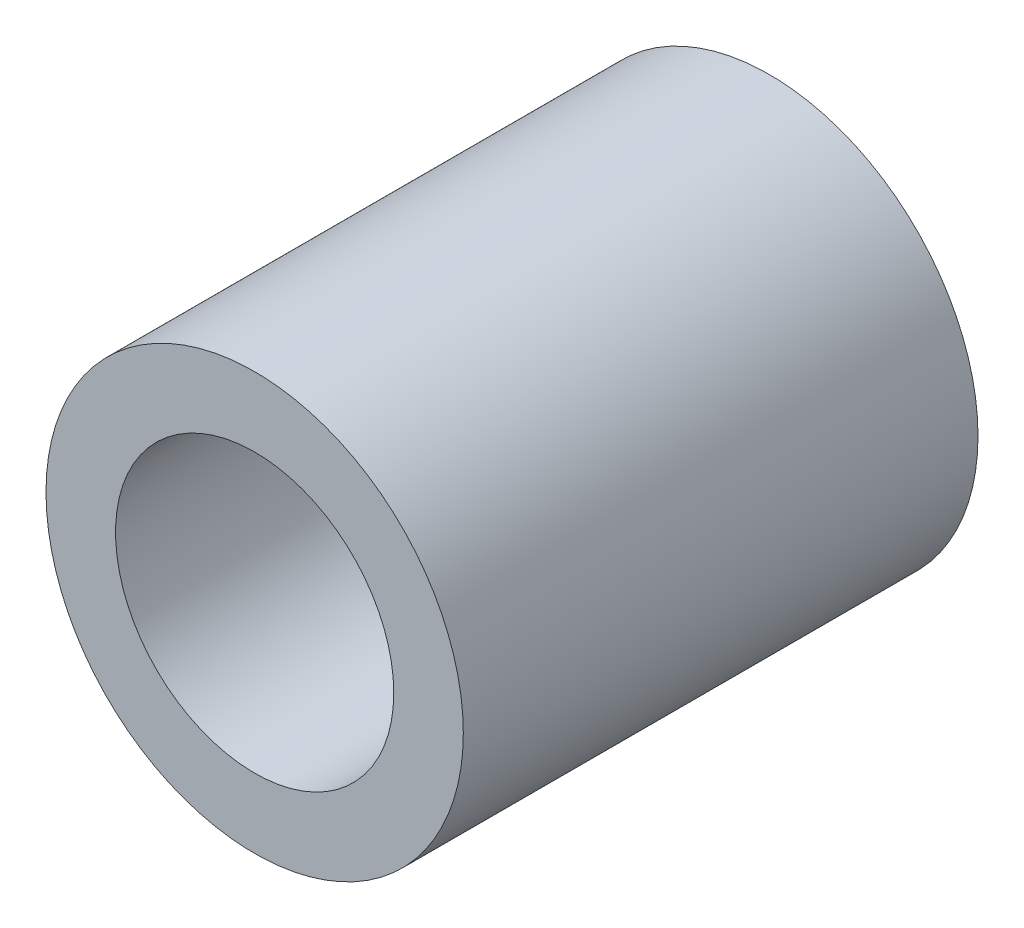
ISO-10303-21;
HEADER;
FILE_DESCRIPTION(('STEP AP214'),'2;1');
FILE_NAME('part.step','',(''),(''),'','','');
FILE_SCHEMA(('AUTOMOTIVE_DESIGN { 1 0 10303 214 1 1 1 1 }'));
ENDSEC;
DATA;
#1=APPLICATION_CONTEXT('core data for automotive mechanical design processes');
#2=APPLICATION_PROTOCOL_DEFINITION('international standard','automotive_design',2000,#1);
#3=PRODUCT_CONTEXT('',#1,'mechanical');
#4=PRODUCT('Part','Part','',(#3));
#5=PRODUCT_RELATED_PRODUCT_CATEGORY('part','',(#4));
#6=PRODUCT_DEFINITION_FORMATION('','',#4);
#7=PRODUCT_DEFINITION_CONTEXT('part definition',#1,'design');
#8=PRODUCT_DEFINITION('design','',#6,#7);
#9=PRODUCT_DEFINITION_SHAPE('','',#8);
#10=(LENGTH_UNIT() NAMED_UNIT(*) SI_UNIT(.MILLI.,.METRE.));
#11=(NAMED_UNIT(*) PLANE_ANGLE_UNIT() SI_UNIT($,.RADIAN.));
#12=(NAMED_UNIT(*) SI_UNIT($,.STERADIAN.) SOLID_ANGLE_UNIT());
#13=UNCERTAINTY_MEASURE_WITH_UNIT(LENGTH_MEASURE(1.E-05),#10,'distance_accuracy_value','');
#14=(GEOMETRIC_REPRESENTATION_CONTEXT(3) GLOBAL_UNCERTAINTY_ASSIGNED_CONTEXT((#13)) GLOBAL_UNIT_ASSIGNED_CONTEXT((#10,
#11,#12)) REPRESENTATION_CONTEXT('',''));
#15=CARTESIAN_POINT('',(0.,0.,0.));
#16=DIRECTION('',(0.,0.,1.));
#17=DIRECTION('',(1.,0.,0.));
#18=AXIS2_PLACEMENT_3D('',#15,#16,#17);
#19=CARTESIAN_POINT('',(0.,0.,5.87375));
#20=DIRECTION('',(0.,0.,1.));
#21=DIRECTION('',(1.,0.,0.));
#22=AXIS2_PLACEMENT_3D('',#19,#20,#21);
#23=PLANE('',#22);
#24=CARTESIAN_POINT('',(0.,0.,5.87375));
#25=DIRECTION('',(0.,0.,1.));
#26=DIRECTION('',(1.,0.,0.));
#27=AXIS2_PLACEMENT_3D('',#24,#25,#26);
#28=CIRCLE('',#27,2.38125);
#29=CARTESIAN_POINT('',(2.38125,0.,5.87375));
#30=VERTEX_POINT('',#29);
#31=EDGE_CURVE('E10',#30,#30,#28,.T.);
#32=ORIENTED_EDGE('',*,*,#31,.T.);
#33=EDGE_LOOP('',(#32));
#34=FACE_BOUND('',#33,.T.);
#35=CARTESIAN_POINT('',(0.,0.,5.87375));
#36=DIRECTION('',(0.,0.,1.));
#37=DIRECTION('',(1.,0.,0.));
#38=AXIS2_PLACEMENT_3D('',#35,#36,#37);
#39=CIRCLE('',#38,1.5875);
#40=CARTESIAN_POINT('',(1.5875,0.,5.87375));
#41=VERTEX_POINT('',#40);
#42=EDGE_CURVE('E56',#41,#41,#39,.T.);
#43=ORIENTED_EDGE('',*,*,#42,.F.);
#44=EDGE_LOOP('',(#43));
#45=FACE_BOUND('',#44,.T.);
#46=ADVANCED_FACE('F43',(#34,#45),#23,.T.);
#47=CARTESIAN_POINT('',(0.,0.,0.));
#48=DIRECTION('',(0.,0.,1.));
#49=DIRECTION('',(1.,0.,0.));
#50=AXIS2_PLACEMENT_3D('',#47,#48,#49);
#51=PLANE('',#50);
#52=CARTESIAN_POINT('',(0.,0.,0.));
#53=DIRECTION('',(0.,0.,1.));
#54=DIRECTION('',(1.,0.,0.));
#55=AXIS2_PLACEMENT_3D('',#52,#53,#54);
#56=CIRCLE('',#55,2.38125);
#57=CARTESIAN_POINT('',(2.38125,0.,0.));
#58=VERTEX_POINT('',#57);
#59=EDGE_CURVE('E47',#58,#58,#56,.T.);
#60=ORIENTED_EDGE('',*,*,#59,.F.);
#61=EDGE_LOOP('',(#60));
#62=FACE_BOUND('',#61,.T.);
#63=CARTESIAN_POINT('',(0.,0.,0.));
#64=DIRECTION('',(0.,0.,1.));
#65=DIRECTION('',(1.,0.,0.));
#66=AXIS2_PLACEMENT_3D('',#63,#64,#65);
#67=CIRCLE('',#66,1.5875);
#68=CARTESIAN_POINT('',(1.5875,0.,0.));
#69=VERTEX_POINT('',#68);
#70=EDGE_CURVE('E58',#69,#69,#67,.T.);
#71=ORIENTED_EDGE('',*,*,#70,.T.);
#72=EDGE_LOOP('',(#71));
#73=FACE_BOUND('',#72,.T.);
#74=ADVANCED_FACE('F70',(#62,#73),#51,.F.);
#75=CARTESIAN_POINT('',(0.,0.,5.87375));
#76=DIRECTION('',(0.,0.,-1.));
#77=DIRECTION('',(-1.,0.,0.));
#78=AXIS2_PLACEMENT_3D('',#75,#76,#77);
#79=CYLINDRICAL_SURFACE('',#78,2.38125);
#80=ORIENTED_EDGE('',*,*,#31,.F.);
#81=EDGE_LOOP('',(#80));
#82=FACE_BOUND('',#81,.T.);
#83=ORIENTED_EDGE('',*,*,#59,.T.);
#84=EDGE_LOOP('',(#83));
#85=FACE_BOUND('',#84,.T.);
#86=ADVANCED_FACE('F45',(#82,#85),#79,.T.);
#87=CARTESIAN_POINT('',(0.,0.,5.87375));
#88=DIRECTION('',(0.,0.,-1.));
#89=DIRECTION('',(-1.,0.,0.));
#90=AXIS2_PLACEMENT_3D('',#87,#88,#89);
#91=CYLINDRICAL_SURFACE('',#90,1.5875);
#92=ORIENTED_EDGE('',*,*,#42,.T.);
#93=EDGE_LOOP('',(#92));
#94=FACE_BOUND('',#93,.T.);
#95=ORIENTED_EDGE('',*,*,#70,.F.);
#96=EDGE_LOOP('',(#95));
#97=FACE_BOUND('',#96,.T.);
#98=ADVANCED_FACE('F66',(#94,#97),#91,.F.);
#99=CLOSED_SHELL('',(#46,#74,#86,#98));
#100=MANIFOLD_SOLID_BREP('B2',#99);
#101=ADVANCED_BREP_SHAPE_REPRESENTATION('',(#18,#100),#14);
#102=SHAPE_DEFINITION_REPRESENTATION(#9,#101);
ENDSEC;
END-ISO-10303-21;
